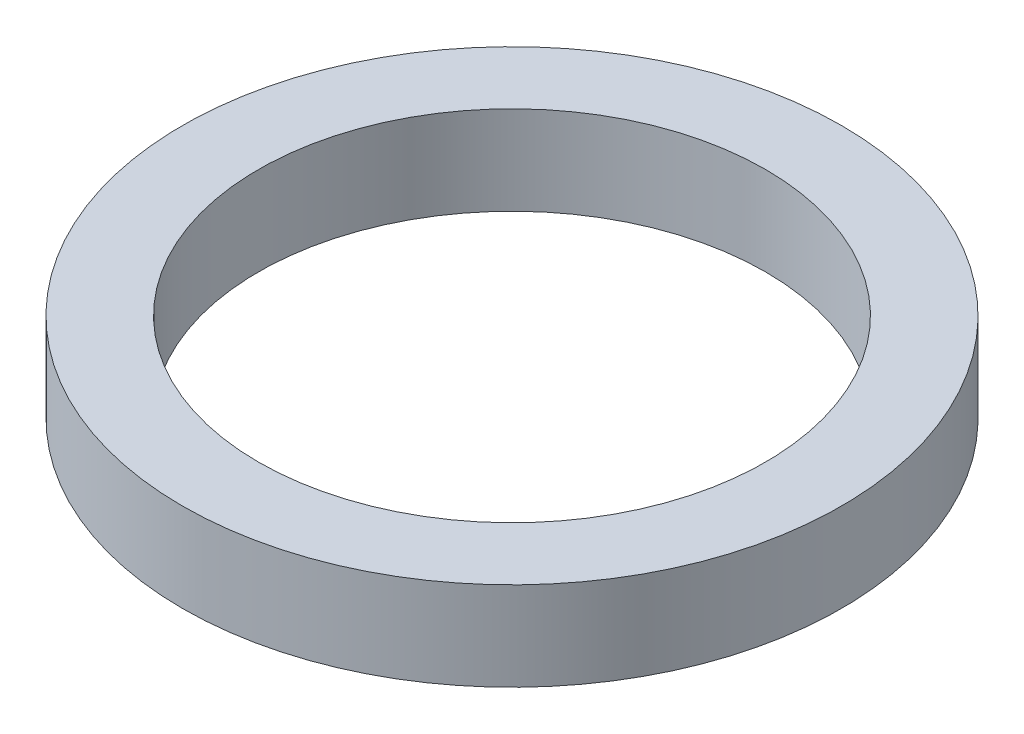
ISO-10303-21;
HEADER;
FILE_DESCRIPTION(('STEP AP214'),'2;1');
FILE_NAME('part.step','',(''),(''),'','','');
FILE_SCHEMA(('AUTOMOTIVE_DESIGN { 1 0 10303 214 1 1 1 1 }'));
ENDSEC;
DATA;
#1=APPLICATION_CONTEXT('core data for automotive mechanical design processes');
#2=APPLICATION_PROTOCOL_DEFINITION('international standard','automotive_design',2000,#1);
#3=PRODUCT_CONTEXT('',#1,'mechanical');
#4=PRODUCT('Part','Part','',(#3));
#5=PRODUCT_RELATED_PRODUCT_CATEGORY('part','',(#4));
#6=PRODUCT_DEFINITION_FORMATION('','',#4);
#7=PRODUCT_DEFINITION_CONTEXT('part definition',#1,'design');
#8=PRODUCT_DEFINITION('design','',#6,#7);
#9=PRODUCT_DEFINITION_SHAPE('','',#8);
#10=(LENGTH_UNIT() NAMED_UNIT(*) SI_UNIT(.MILLI.,.METRE.));
#11=(NAMED_UNIT(*) PLANE_ANGLE_UNIT() SI_UNIT($,.RADIAN.));
#12=(NAMED_UNIT(*) SI_UNIT($,.STERADIAN.) SOLID_ANGLE_UNIT());
#13=UNCERTAINTY_MEASURE_WITH_UNIT(LENGTH_MEASURE(1.E-05),#10,'distance_accuracy_value','');
#14=(GEOMETRIC_REPRESENTATION_CONTEXT(3) GLOBAL_UNCERTAINTY_ASSIGNED_CONTEXT((#13)) GLOBAL_UNIT_ASSIGNED_CONTEXT((#10,
#11,#12)) REPRESENTATION_CONTEXT('',''));
#15=CARTESIAN_POINT('',(0.,0.,0.));
#16=DIRECTION('',(0.,0.,1.));
#17=DIRECTION('',(1.,0.,0.));
#18=AXIS2_PLACEMENT_3D('',#15,#16,#17);
#19=CARTESIAN_POINT('',(0.,7.,0.));
#20=DIRECTION('',(0.,1.,0.));
#21=DIRECTION('',(0.,0.,1.));
#22=AXIS2_PLACEMENT_3D('',#19,#20,#21);
#23=PLANE('',#22);
#24=CARTESIAN_POINT('',(0.,7.,0.));
#25=DIRECTION('',(0.,1.,0.));
#26=DIRECTION('',(0.,0.,1.));
#27=AXIS2_PLACEMENT_3D('',#24,#25,#26);
#28=CIRCLE('',#27,26.);
#29=CARTESIAN_POINT('',(0.,7.,26.));
#30=VERTEX_POINT('',#29);
#31=EDGE_CURVE('E10',#30,#30,#28,.T.);
#32=ORIENTED_EDGE('',*,*,#31,.T.);
#33=EDGE_LOOP('',(#32));
#34=FACE_BOUND('',#33,.T.);
#35=CARTESIAN_POINT('',(0.,7.,0.));
#36=DIRECTION('',(0.,1.,0.));
#37=DIRECTION('',(0.,0.,1.));
#38=AXIS2_PLACEMENT_3D('',#35,#36,#37);
#39=CIRCLE('',#38,20.);
#40=CARTESIAN_POINT('',(0.,7.,20.));
#41=VERTEX_POINT('',#40);
#42=EDGE_CURVE('E57',#41,#41,#39,.T.);
#43=ORIENTED_EDGE('',*,*,#42,.F.);
#44=EDGE_LOOP('',(#43));
#45=FACE_BOUND('',#44,.T.);
#46=ADVANCED_FACE('F43',(#34,#45),#23,.T.);
#47=CARTESIAN_POINT('',(0.,0.,0.));
#48=DIRECTION('',(0.,1.,0.));
#49=DIRECTION('',(0.,0.,1.));
#50=AXIS2_PLACEMENT_3D('',#47,#48,#49);
#51=PLANE('',#50);
#52=CARTESIAN_POINT('',(0.,0.,0.));
#53=DIRECTION('',(0.,1.,0.));
#54=DIRECTION('',(0.,0.,1.));
#55=AXIS2_PLACEMENT_3D('',#52,#53,#54);
#56=CIRCLE('',#55,26.);
#57=CARTESIAN_POINT('',(0.,0.,26.));
#58=VERTEX_POINT('',#57);
#59=EDGE_CURVE('E50',#58,#58,#56,.T.);
#60=ORIENTED_EDGE('',*,*,#59,.F.);
#61=EDGE_LOOP('',(#60));
#62=FACE_BOUND('',#61,.T.);
#63=CARTESIAN_POINT('',(0.,0.,0.));
#64=DIRECTION('',(0.,1.,0.));
#65=DIRECTION('',(0.,0.,1.));
#66=AXIS2_PLACEMENT_3D('',#63,#64,#65);
#67=CIRCLE('',#66,20.);
#68=CARTESIAN_POINT('',(0.,0.,20.));
#69=VERTEX_POINT('',#68);
#70=EDGE_CURVE('E59',#69,#69,#67,.T.);
#71=ORIENTED_EDGE('',*,*,#70,.T.);
#72=EDGE_LOOP('',(#71));
#73=FACE_BOUND('',#72,.T.);
#74=ADVANCED_FACE('F68',(#62,#73),#51,.F.);
#75=CARTESIAN_POINT('',(0.,7.,0.));
#76=DIRECTION('',(0.,-1.,0.));
#77=DIRECTION('',(0.,0.,-1.));
#78=AXIS2_PLACEMENT_3D('',#75,#76,#77);
#79=CYLINDRICAL_SURFACE('',#78,26.);
#80=ORIENTED_EDGE('',*,*,#31,.F.);
#81=EDGE_LOOP('',(#80));
#82=FACE_BOUND('',#81,.T.);
#83=ORIENTED_EDGE('',*,*,#59,.T.);
#84=EDGE_LOOP('',(#83));
#85=FACE_BOUND('',#84,.T.);
#86=ADVANCED_FACE('F44',(#82,#85),#79,.T.);
#87=CARTESIAN_POINT('',(0.,7.,0.));
#88=DIRECTION('',(0.,-1.,0.));
#89=DIRECTION('',(0.,0.,-1.));
#90=AXIS2_PLACEMENT_3D('',#87,#88,#89);
#91=CYLINDRICAL_SURFACE('',#90,20.);
#92=ORIENTED_EDGE('',*,*,#42,.T.);
#93=EDGE_LOOP('',(#92));
#94=FACE_BOUND('',#93,.T.);
#95=ORIENTED_EDGE('',*,*,#70,.F.);
#96=EDGE_LOOP('',(#95));
#97=FACE_BOUND('',#96,.T.);
#98=ADVANCED_FACE('F67',(#94,#97),#91,.F.);
#99=CLOSED_SHELL('',(#46,#74,#86,#98));
#100=MANIFOLD_SOLID_BREP('B2',#99);
#101=ADVANCED_BREP_SHAPE_REPRESENTATION('',(#18,#100),#14);
#102=SHAPE_DEFINITION_REPRESENTATION(#9,#101);
ENDSEC;
END-ISO-10303-21;
